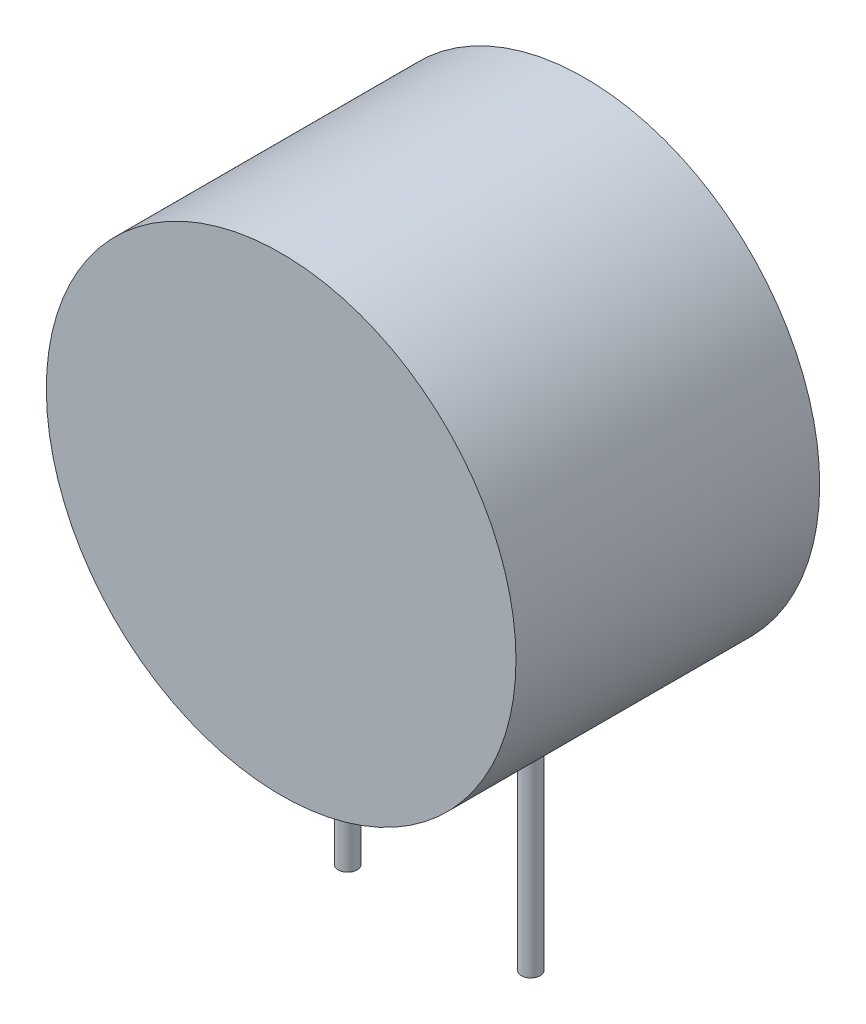
ISO-10303-21;
HEADER;
FILE_DESCRIPTION(('STEP AP214'),'2;1');
FILE_NAME('part.step','',(''),(''),'','','');
FILE_SCHEMA(('AUTOMOTIVE_DESIGN { 1 0 10303 214 1 1 1 1 }'));
ENDSEC;
DATA;
#1=APPLICATION_CONTEXT('core data for automotive mechanical design processes');
#2=APPLICATION_PROTOCOL_DEFINITION('international standard','automotive_design',2000,#1);
#3=PRODUCT_CONTEXT('',#1,'mechanical');
#4=PRODUCT('Part','Part','',(#3));
#5=PRODUCT_RELATED_PRODUCT_CATEGORY('part','',(#4));
#6=PRODUCT_DEFINITION_FORMATION('','',#4);
#7=PRODUCT_DEFINITION_CONTEXT('part definition',#1,'design');
#8=PRODUCT_DEFINITION('design','',#6,#7);
#9=PRODUCT_DEFINITION_SHAPE('','',#8);
#10=(LENGTH_UNIT() NAMED_UNIT(*) SI_UNIT(.MILLI.,.METRE.));
#11=(NAMED_UNIT(*) PLANE_ANGLE_UNIT() SI_UNIT($,.RADIAN.));
#12=(NAMED_UNIT(*) SI_UNIT($,.STERADIAN.) SOLID_ANGLE_UNIT());
#13=UNCERTAINTY_MEASURE_WITH_UNIT(LENGTH_MEASURE(1.E-05),#10,'distance_accuracy_value','');
#14=(GEOMETRIC_REPRESENTATION_CONTEXT(3) GLOBAL_UNCERTAINTY_ASSIGNED_CONTEXT((#13)) GLOBAL_UNIT_ASSIGNED_CONTEXT((#10,
#11,#12)) REPRESENTATION_CONTEXT('',''));
#15=CARTESIAN_POINT('',(0.,0.,0.));
#16=DIRECTION('',(0.,0.,1.));
#17=DIRECTION('',(1.,0.,0.));
#18=AXIS2_PLACEMENT_3D('',#15,#16,#17);
#19=CARTESIAN_POINT('',(0.,0.,97.));
#20=DIRECTION('',(0.,0.,-1.));
#21=DIRECTION('',(-1.,0.,0.));
#22=AXIS2_PLACEMENT_3D('',#19,#20,#21);
#23=CYLINDRICAL_SURFACE('',#22,75.);
#24=CARTESIAN_POINT('',(0.,0.,77.));
#25=DIRECTION('',(0.,0.,1.));
#26=DIRECTION('',(1.,0.,0.));
#27=AXIS2_PLACEMENT_3D('',#24,#25,#26);
#28=CIRCLE('',#27,75.);
#29=CARTESIAN_POINT('',(35.6230262611137,-66.0000000000001,77.));
#30=VERTEX_POINT('',#29);
#31=CARTESIAN_POINT('',(-35.6230262611137,-66.,77.));
#32=VERTEX_POINT('',#31);
#33=EDGE_CURVE('E149',#30,#32,#28,.F.);
#34=ORIENTED_EDGE('',*,*,#33,.F.);
#35=DIRECTION('',(0.,0.,-1.));
#36=VECTOR('',#35,1.);
#37=CARTESIAN_POINT('',(35.6230262611137,-66.,148.812255221515));
#38=LINE('',#37,#36);
#39=CARTESIAN_POINT('',(35.6230262611137,-66.,14.5));
#40=VERTEX_POINT('',#39);
#41=EDGE_CURVE('E158',#30,#40,#38,.T.);
#42=ORIENTED_EDGE('',*,*,#41,.T.);
#43=CARTESIAN_POINT('',(0.,0.,14.5));
#44=DIRECTION('',(0.,0.,-1.));
#45=DIRECTION('',(-1.,0.,0.));
#46=AXIS2_PLACEMENT_3D('',#43,#44,#45);
#47=CIRCLE('',#46,75.);
#48=CARTESIAN_POINT('',(-35.6230262611137,-66.,14.5));
#49=VERTEX_POINT('',#48);
#50=EDGE_CURVE('E145',#40,#49,#47,.T.);
#51=ORIENTED_EDGE('',*,*,#50,.T.);
#52=DIRECTION('',(0.,0.,-1.));
#53=VECTOR('',#52,1.);
#54=CARTESIAN_POINT('',(-35.6230262611137,-66.,148.812255221515));
#55=LINE('',#54,#53);
#56=EDGE_CURVE('E154',#32,#49,#55,.T.);
#57=ORIENTED_EDGE('',*,*,#56,.F.);
#58=EDGE_LOOP('',(#34,#42,#51,#57));
#59=FACE_BOUND('',#58,.T.);
#60=CARTESIAN_POINT('',(0.,0.,97.));
#61=DIRECTION('',(0.,0.,1.));
#62=DIRECTION('',(1.,0.,0.));
#63=AXIS2_PLACEMENT_3D('',#60,#61,#62);
#64=CIRCLE('',#63,75.);
#65=CARTESIAN_POINT('',(75.,0.,97.));
#66=VERTEX_POINT('',#65);
#67=EDGE_CURVE('E164',#66,#66,#64,.T.);
#68=ORIENTED_EDGE('',*,*,#67,.F.);
#69=EDGE_LOOP('',(#68));
#70=FACE_BOUND('',#69,.T.);
#71=CARTESIAN_POINT('',(0.,0.,0.));
#72=DIRECTION('',(0.,0.,1.));
#73=DIRECTION('',(1.,0.,0.));
#74=AXIS2_PLACEMENT_3D('',#71,#72,#73);
#75=CIRCLE('',#74,75.);
#76=CARTESIAN_POINT('',(18.925,-72.5730278753753,0.));
#77=VERTEX_POINT('',#76);
#78=CARTESIAN_POINT('',(-18.925,-72.5730278753753,0.));
#79=VERTEX_POINT('',#78);
#80=EDGE_CURVE('E59',#77,#79,#75,.T.);
#81=ORIENTED_EDGE('',*,*,#80,.T.);
#82=DIRECTION('',(0.,0.,1.));
#83=VECTOR('',#82,1.);
#84=CARTESIAN_POINT('',(-18.9249999999999,-72.5730278753753,-12.25));
#85=LINE('',#84,#83);
#86=CARTESIAN_POINT('',(-18.9249999999999,-72.5730278753753,-12.25));
#87=VERTEX_POINT('',#86);
#88=EDGE_CURVE('E99',#87,#79,#85,.T.);
#89=ORIENTED_EDGE('',*,*,#88,.F.);
#90=CARTESIAN_POINT('',(0.,0.,-12.25));
#91=DIRECTION('',(0.,0.,-1.));
#92=DIRECTION('',(-1.,0.,0.));
#93=AXIS2_PLACEMENT_3D('',#90,#91,#92);
#94=CIRCLE('',#93,75.);
#95=CARTESIAN_POINT('',(18.9249999999999,-72.5730278753753,-12.25));
#96=VERTEX_POINT('',#95);
#97=EDGE_CURVE('E102',#96,#87,#94,.T.);
#98=ORIENTED_EDGE('',*,*,#97,.F.);
#99=DIRECTION('',(0.,0.,1.));
#100=VECTOR('',#99,1.);
#101=CARTESIAN_POINT('',(18.9249999999999,-72.5730278753753,-12.25));
#102=LINE('',#101,#100);
#103=EDGE_CURVE('E90',#96,#77,#102,.T.);
#104=ORIENTED_EDGE('',*,*,#103,.T.);
#105=EDGE_LOOP('',(#81,#89,#98,#104));
#106=FACE_BOUND('',#105,.T.);
#107=ADVANCED_FACE('F39',(#59,#70,#106),#23,.T.);
#108=CARTESIAN_POINT('',(0.,0.,97.));
#109=DIRECTION('',(0.,0.,1.));
#110=DIRECTION('',(1.,0.,0.));
#111=AXIS2_PLACEMENT_3D('',#108,#109,#110);
#112=PLANE('',#111);
#113=ORIENTED_EDGE('',*,*,#67,.T.);
#114=EDGE_LOOP('',(#113));
#115=FACE_BOUND('',#114,.T.);
#116=ADVANCED_FACE('F201',(#115),#112,.T.);
#117=CARTESIAN_POINT('',(0.,0.,0.));
#118=DIRECTION('',(0.,0.,1.));
#119=DIRECTION('',(1.,0.,0.));
#120=AXIS2_PLACEMENT_3D('',#117,#118,#119);
#121=PLANE('',#120);
#122=ORIENTED_EDGE('',*,*,#80,.F.);
#123=DIRECTION('',(0.,1.,0.));
#124=VECTOR('',#123,1.);
#125=CARTESIAN_POINT('',(18.925,0.,0.));
#126=LINE('',#125,#124);
#127=CARTESIAN_POINT('',(18.925,-32.5730278753753,0.));
#128=VERTEX_POINT('',#127);
#129=EDGE_CURVE('E54',#77,#128,#126,.T.);
#130=ORIENTED_EDGE('',*,*,#129,.T.);
#131=DIRECTION('',(-1.,0.,0.));
#132=VECTOR('',#131,1.);
#133=CARTESIAN_POINT('',(0.,-32.5730278753753,0.));
#134=LINE('',#133,#132);
#135=CARTESIAN_POINT('',(-18.925,-32.5730278753753,0.));
#136=VERTEX_POINT('',#135);
#137=EDGE_CURVE('E113',#128,#136,#134,.T.);
#138=ORIENTED_EDGE('',*,*,#137,.T.);
#139=DIRECTION('',(0.,1.,0.));
#140=VECTOR('',#139,1.);
#141=CARTESIAN_POINT('',(-18.925,0.,0.));
#142=LINE('',#141,#140);
#143=EDGE_CURVE('E116',#79,#136,#142,.T.);
#144=ORIENTED_EDGE('',*,*,#143,.F.);
#145=EDGE_LOOP('',(#122,#130,#138,#144));
#146=FACE_BOUND('',#145,.T.);
#147=ADVANCED_FACE('F193',(#146),#121,.F.);
#148=CARTESIAN_POINT('',(0.,0.,77.));
#149=DIRECTION('',(0.,0.,1.));
#150=DIRECTION('',(1.,0.,0.));
#151=AXIS2_PLACEMENT_3D('',#148,#149,#150);
#152=PLANE('',#151);
#153=DIRECTION('',(1.,0.,0.));
#154=VECTOR('',#153,1.);
#155=CARTESIAN_POINT('',(0.,-66.,77.));
#156=LINE('',#155,#154);
#157=EDGE_CURVE('E155',#32,#30,#156,.T.);
#158=ORIENTED_EDGE('',*,*,#157,.T.);
#159=ORIENTED_EDGE('',*,*,#33,.T.);
#160=EDGE_LOOP('',(#158,#159));
#161=FACE_BOUND('',#160,.T.);
#162=ADVANCED_FACE('F191',(#161),#152,.F.);
#163=CARTESIAN_POINT('',(0.,0.,14.5));
#164=DIRECTION('',(0.,0.,-1.));
#165=DIRECTION('',(-1.,0.,0.));
#166=AXIS2_PLACEMENT_3D('',#163,#164,#165);
#167=PLANE('',#166);
#168=DIRECTION('',(1.,0.,0.));
#169=VECTOR('',#168,1.);
#170=CARTESIAN_POINT('',(0.,-66.,14.5));
#171=LINE('',#170,#169);
#172=EDGE_CURVE('E144',#49,#40,#171,.T.);
#173=ORIENTED_EDGE('',*,*,#172,.F.);
#174=ORIENTED_EDGE('',*,*,#50,.F.);
#175=EDGE_LOOP('',(#173,#174));
#176=FACE_BOUND('',#175,.T.);
#177=ADVANCED_FACE('F178',(#176),#167,.F.);
#178=CARTESIAN_POINT('',(0.,-66.,148.812255221515));
#179=DIRECTION('',(0.,1.,0.));
#180=DIRECTION('',(0.,0.,1.));
#181=AXIS2_PLACEMENT_3D('',#178,#179,#180);
#182=PLANE('',#181);
#183=CARTESIAN_POINT('',(29.25,-66.,46.5));
#184=DIRECTION('',(0.,1.,0.));
#185=DIRECTION('',(0.,0.,1.));
#186=AXIS2_PLACEMENT_3D('',#183,#184,#185);
#187=CIRCLE('',#186,3.);
#188=CARTESIAN_POINT('',(29.25,-66.,49.5));
#189=VERTEX_POINT('',#188);
#190=EDGE_CURVE('E11',#189,#189,#187,.F.);
#191=ORIENTED_EDGE('',*,*,#190,.F.);
#192=EDGE_LOOP('',(#191));
#193=FACE_BOUND('',#192,.T.);
#194=CARTESIAN_POINT('',(-29.25,-66.,46.5));
#195=DIRECTION('',(0.,1.,0.));
#196=DIRECTION('',(0.,0.,1.));
#197=AXIS2_PLACEMENT_3D('',#194,#195,#196);
#198=CIRCLE('',#197,3.);
#199=CARTESIAN_POINT('',(-29.25,-66.,49.5));
#200=VERTEX_POINT('',#199);
#201=EDGE_CURVE('E47',#200,#200,#198,.F.);
#202=ORIENTED_EDGE('',*,*,#201,.F.);
#203=EDGE_LOOP('',(#202));
#204=FACE_BOUND('',#203,.T.);
#205=ORIENTED_EDGE('',*,*,#56,.T.);
#206=ORIENTED_EDGE('',*,*,#172,.T.);
#207=ORIENTED_EDGE('',*,*,#41,.F.);
#208=ORIENTED_EDGE('',*,*,#157,.F.);
#209=EDGE_LOOP('',(#205,#206,#207,#208));
#210=FACE_BOUND('',#209,.T.);
#211=ADVANCED_FACE('F175',(#193,#204,#210),#182,.F.);
#212=CARTESIAN_POINT('',(-29.25,-134.,46.5));
#213=DIRECTION('',(0.,1.,0.));
#214=DIRECTION('',(0.,0.,1.));
#215=AXIS2_PLACEMENT_3D('',#212,#213,#214);
#216=CYLINDRICAL_SURFACE('',#215,3.);
#217=CARTESIAN_POINT('',(-29.25,-134.,46.5));
#218=DIRECTION('',(0.,-1.,0.));
#219=DIRECTION('',(0.,0.,-1.));
#220=AXIS2_PLACEMENT_3D('',#217,#218,#219);
#221=CIRCLE('',#220,3.);
#222=CARTESIAN_POINT('',(-29.25,-134.,43.5));
#223=VERTEX_POINT('',#222);
#224=EDGE_CURVE('E140',#223,#223,#221,.T.);
#225=ORIENTED_EDGE('',*,*,#224,.F.);
#226=EDGE_LOOP('',(#225));
#227=FACE_BOUND('',#226,.T.);
#228=ORIENTED_EDGE('',*,*,#201,.T.);
#229=EDGE_LOOP('',(#228));
#230=FACE_BOUND('',#229,.T.);
#231=ADVANCED_FACE('F173',(#227,#230),#216,.T.);
#232=CARTESIAN_POINT('',(-29.25,-134.,46.5));
#233=DIRECTION('',(0.,-1.,0.));
#234=DIRECTION('',(0.,0.,-1.));
#235=AXIS2_PLACEMENT_3D('',#232,#233,#234);
#236=PLANE('',#235);
#237=ORIENTED_EDGE('',*,*,#224,.T.);
#238=EDGE_LOOP('',(#237));
#239=FACE_BOUND('',#238,.T.);
#240=ADVANCED_FACE('F269',(#239),#236,.T.);
#241=CARTESIAN_POINT('',(29.25,-134.,46.5));
#242=DIRECTION('',(0.,1.,0.));
#243=DIRECTION('',(0.,0.,1.));
#244=AXIS2_PLACEMENT_3D('',#241,#242,#243);
#245=CYLINDRICAL_SURFACE('',#244,3.);
#246=CARTESIAN_POINT('',(29.25,-134.,46.5));
#247=DIRECTION('',(0.,-1.,0.));
#248=DIRECTION('',(0.,0.,1.));
#249=AXIS2_PLACEMENT_3D('',#246,#247,#248);
#250=CIRCLE('',#249,3.);
#251=CARTESIAN_POINT('',(29.25,-134.,49.5));
#252=VERTEX_POINT('',#251);
#253=EDGE_CURVE('E98',#252,#252,#250,.T.);
#254=ORIENTED_EDGE('',*,*,#253,.F.);
#255=EDGE_LOOP('',(#254));
#256=FACE_BOUND('',#255,.T.);
#257=ORIENTED_EDGE('',*,*,#190,.T.);
#258=EDGE_LOOP('',(#257));
#259=FACE_BOUND('',#258,.T.);
#260=ADVANCED_FACE('F265',(#256,#259),#245,.T.);
#261=CARTESIAN_POINT('',(29.25,-134.,46.5));
#262=DIRECTION('',(0.,1.,0.));
#263=DIRECTION('',(0.,0.,1.));
#264=AXIS2_PLACEMENT_3D('',#261,#262,#263);
#265=PLANE('',#264);
#266=ORIENTED_EDGE('',*,*,#253,.T.);
#267=EDGE_LOOP('',(#266));
#268=FACE_BOUND('',#267,.T.);
#269=ADVANCED_FACE('F229',(#268),#265,.F.);
#270=CARTESIAN_POINT('',(18.925,0.,-12.25));
#271=DIRECTION('',(1.,0.,0.));
#272=DIRECTION('',(0.,0.,-1.));
#273=AXIS2_PLACEMENT_3D('',#270,#271,#272);
#274=PLANE('',#273);
#275=ORIENTED_EDGE('',*,*,#129,.F.);
#276=ORIENTED_EDGE('',*,*,#103,.F.);
#277=DIRECTION('',(0.,1.,0.));
#278=VECTOR('',#277,1.);
#279=CARTESIAN_POINT('',(18.925,0.,-12.25));
#280=LINE('',#279,#278);
#281=CARTESIAN_POINT('',(18.925,-32.5730278753753,-12.25));
#282=VERTEX_POINT('',#281);
#283=EDGE_CURVE('E94',#96,#282,#280,.T.);
#284=ORIENTED_EDGE('',*,*,#283,.T.);
#285=DIRECTION('',(0.,0.,1.));
#286=VECTOR('',#285,1.);
#287=CARTESIAN_POINT('',(18.925,-32.5730278753753,-12.25));
#288=LINE('',#287,#286);
#289=EDGE_CURVE('E123',#282,#128,#288,.T.);
#290=ORIENTED_EDGE('',*,*,#289,.T.);
#291=EDGE_LOOP('',(#275,#276,#284,#290));
#292=FACE_BOUND('',#291,.T.);
#293=ADVANCED_FACE('F92',(#292),#274,.T.);
#294=CARTESIAN_POINT('',(-18.925,0.,-12.25));
#295=DIRECTION('',(1.,0.,0.));
#296=DIRECTION('',(0.,0.,-1.));
#297=AXIS2_PLACEMENT_3D('',#294,#295,#296);
#298=PLANE('',#297);
#299=ORIENTED_EDGE('',*,*,#143,.T.);
#300=DIRECTION('',(0.,0.,1.));
#301=VECTOR('',#300,1.);
#302=CARTESIAN_POINT('',(-18.925,-32.5730278753753,-12.25));
#303=LINE('',#302,#301);
#304=CARTESIAN_POINT('',(-18.925,-32.5730278753753,-12.25));
#305=VERTEX_POINT('',#304);
#306=EDGE_CURVE('E131',#305,#136,#303,.T.);
#307=ORIENTED_EDGE('',*,*,#306,.F.);
#308=DIRECTION('',(0.,1.,0.));
#309=VECTOR('',#308,1.);
#310=CARTESIAN_POINT('',(-18.925,0.,-12.25));
#311=LINE('',#310,#309);
#312=EDGE_CURVE('E107',#87,#305,#311,.T.);
#313=ORIENTED_EDGE('',*,*,#312,.F.);
#314=ORIENTED_EDGE('',*,*,#88,.T.);
#315=EDGE_LOOP('',(#299,#307,#313,#314));
#316=FACE_BOUND('',#315,.T.);
#317=ADVANCED_FACE('F228',(#316),#298,.F.);
#318=CARTESIAN_POINT('',(0.,-32.5730278753753,-12.25));
#319=DIRECTION('',(0.,1.,0.));
#320=DIRECTION('',(0.,0.,1.));
#321=AXIS2_PLACEMENT_3D('',#318,#319,#320);
#322=PLANE('',#321);
#323=ORIENTED_EDGE('',*,*,#137,.F.);
#324=ORIENTED_EDGE('',*,*,#289,.F.);
#325=DIRECTION('',(-1.,0.,0.));
#326=VECTOR('',#325,1.);
#327=CARTESIAN_POINT('',(0.,-32.5730278753753,-12.25));
#328=LINE('',#327,#326);
#329=EDGE_CURVE('E111',#282,#305,#328,.T.);
#330=ORIENTED_EDGE('',*,*,#329,.T.);
#331=ORIENTED_EDGE('',*,*,#306,.T.);
#332=EDGE_LOOP('',(#323,#324,#330,#331));
#333=FACE_BOUND('',#332,.T.);
#334=ADVANCED_FACE('F238',(#333),#322,.T.);
#335=CARTESIAN_POINT('',(0.,0.,-12.25));
#336=DIRECTION('',(0.,0.,-1.));
#337=DIRECTION('',(-1.,0.,0.));
#338=AXIS2_PLACEMENT_3D('',#335,#336,#337);
#339=PLANE('',#338);
#340=ORIENTED_EDGE('',*,*,#283,.F.);
#341=ORIENTED_EDGE('',*,*,#97,.T.);
#342=ORIENTED_EDGE('',*,*,#312,.T.);
#343=ORIENTED_EDGE('',*,*,#329,.F.);
#344=EDGE_LOOP('',(#340,#341,#342,#343));
#345=FACE_BOUND('',#344,.T.);
#346=ADVANCED_FACE('F109',(#345),#339,.T.);
#347=CLOSED_SHELL('',(#107,#116,#147,#162,#177,#211,#231,#240,#260,#269,#293,#317,#334,#346));
#348=MANIFOLD_SOLID_BREP('B2',#347);
#349=ADVANCED_BREP_SHAPE_REPRESENTATION('',(#18,#348),#14);
#350=SHAPE_DEFINITION_REPRESENTATION(#9,#349);
ENDSEC;
END-ISO-10303-21;
